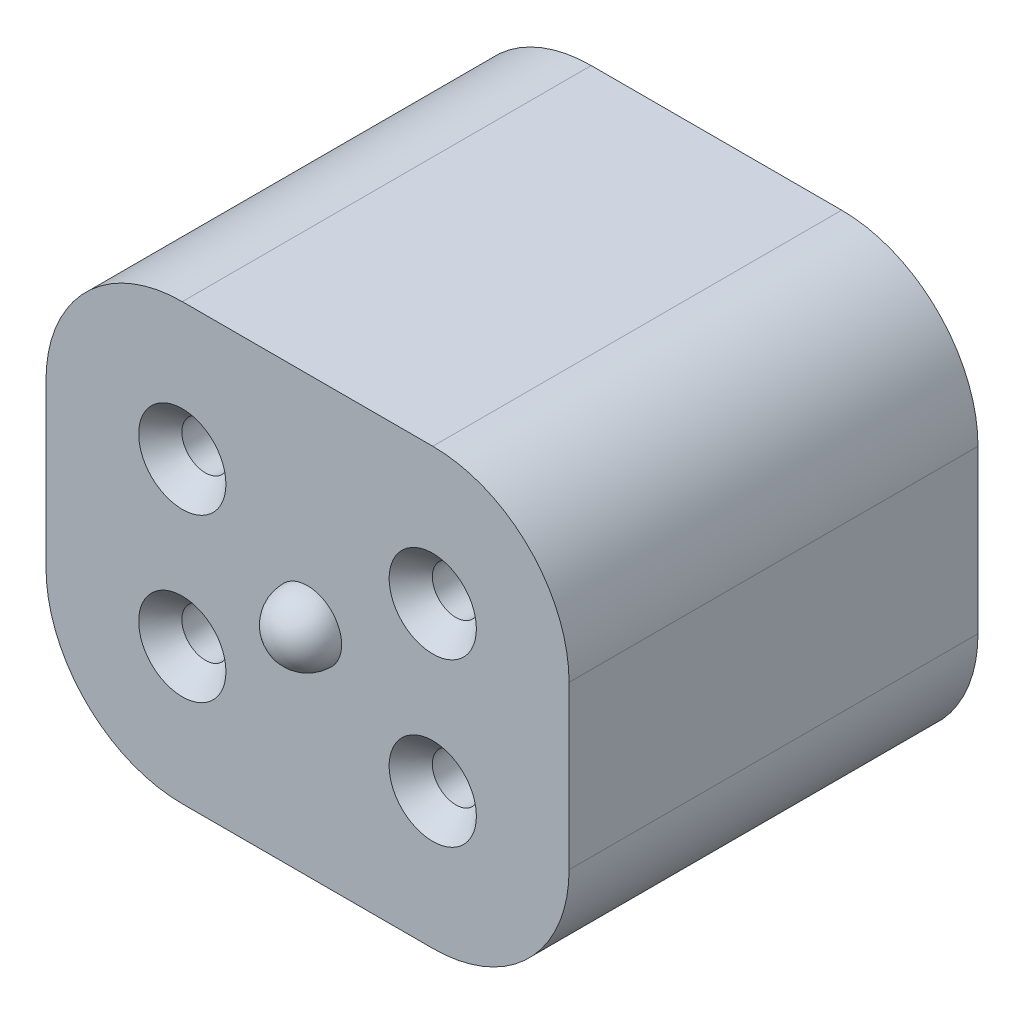
ISO-10303-21;
HEADER;
FILE_DESCRIPTION(('STEP AP214'),'2;1');
FILE_NAME('part.step','',(''),(''),'','','');
FILE_SCHEMA(('AUTOMOTIVE_DESIGN { 1 0 10303 214 1 1 1 1 }'));
ENDSEC;
DATA;
#1=APPLICATION_CONTEXT('core data for automotive mechanical design processes');
#2=APPLICATION_PROTOCOL_DEFINITION('international standard','automotive_design',2000,#1);
#3=PRODUCT_CONTEXT('',#1,'mechanical');
#4=PRODUCT('Part','Part','',(#3));
#5=PRODUCT_RELATED_PRODUCT_CATEGORY('part','',(#4));
#6=PRODUCT_DEFINITION_FORMATION('','',#4);
#7=PRODUCT_DEFINITION_CONTEXT('part definition',#1,'design');
#8=PRODUCT_DEFINITION('design','',#6,#7);
#9=PRODUCT_DEFINITION_SHAPE('','',#8);
#10=(LENGTH_UNIT() NAMED_UNIT(*) SI_UNIT(.MILLI.,.METRE.));
#11=(NAMED_UNIT(*) PLANE_ANGLE_UNIT() SI_UNIT($,.RADIAN.));
#12=(NAMED_UNIT(*) SI_UNIT($,.STERADIAN.) SOLID_ANGLE_UNIT());
#13=UNCERTAINTY_MEASURE_WITH_UNIT(LENGTH_MEASURE(1.E-05),#10,'distance_accuracy_value','');
#14=(GEOMETRIC_REPRESENTATION_CONTEXT(3) GLOBAL_UNCERTAINTY_ASSIGNED_CONTEXT((#13)) GLOBAL_UNIT_ASSIGNED_CONTEXT((#10,
#11,#12)) REPRESENTATION_CONTEXT('',''));
#15=CARTESIAN_POINT('',(0.,0.,0.));
#16=DIRECTION('',(0.,0.,1.));
#17=DIRECTION('',(1.,0.,0.));
#18=AXIS2_PLACEMENT_3D('',#15,#16,#17);
#19=CARTESIAN_POINT('',(9.99999999999999,-9.99999999999999,30.));
#20=DIRECTION('',(0.,0.,1.));
#21=DIRECTION('',(1.,0.,0.));
#22=AXIS2_PLACEMENT_3D('',#19,#20,#21);
#23=CYLINDRICAL_SURFACE('',#22,1.72719999999999);
#24=CARTESIAN_POINT('',(9.99999999999999,-9.99999999999999,28.305277262482));
#25=DIRECTION('',(0.,0.,1.));
#26=DIRECTION('',(1.,0.,0.));
#27=AXIS2_PLACEMENT_3D('',#24,#25,#26);
#28=CIRCLE('',#27,1.72719999999999);
#29=CARTESIAN_POINT('',(11.7272,-9.99999999999999,28.305277262482));
#30=VERTEX_POINT('',#29);
#31=EDGE_CURVE('E262',#30,#30,#28,.T.);
#32=ORIENTED_EDGE('',*,*,#31,.T.);
#33=EDGE_LOOP('',(#32));
#34=FACE_BOUND('',#33,.T.);
#35=DIRECTION('',(0.,0.,-1.));
#36=VECTOR('',#35,1.);
#37=CARTESIAN_POINT('',(11.4494959190641,-10.9392451334005,10.));
#38=LINE('',#37,#36);
#39=CARTESIAN_POINT('',(11.4494959190641,-10.9392451334005,10.));
#40=VERTEX_POINT('',#39);
#41=CARTESIAN_POINT('',(11.4494959190641,-10.9392451334005,0.));
#42=VERTEX_POINT('',#41);
#43=EDGE_CURVE('E224',#40,#42,#38,.T.);
#44=ORIENTED_EDGE('',*,*,#43,.F.);
#45=CARTESIAN_POINT('',(9.99999999999999,-9.99999999999999,10.));
#46=DIRECTION('',(0.,0.,-1.));
#47=DIRECTION('',(-1.,0.,0.));
#48=AXIS2_PLACEMENT_3D('',#45,#46,#47);
#49=CIRCLE('',#48,1.72719999999999);
#50=CARTESIAN_POINT('',(9.99999999999999,-11.7272,10.));
#51=VERTEX_POINT('',#50);
#52=EDGE_CURVE('E200',#51,#40,#49,.F.);
#53=ORIENTED_EDGE('',*,*,#52,.F.);
#54=DIRECTION('',(0.,0.,-1.));
#55=VECTOR('',#54,1.);
#56=CARTESIAN_POINT('',(9.99999999999999,-11.7272,10.));
#57=LINE('',#56,#55);
#58=CARTESIAN_POINT('',(9.99999999999999,-11.7272,0.));
#59=VERTEX_POINT('',#58);
#60=EDGE_CURVE('E228',#51,#59,#57,.T.);
#61=ORIENTED_EDGE('',*,*,#60,.T.);
#62=CARTESIAN_POINT('',(9.99999999999999,-9.99999999999999,0.));
#63=DIRECTION('',(0.,0.,1.));
#64=DIRECTION('',(1.,0.,0.));
#65=AXIS2_PLACEMENT_3D('',#62,#63,#64);
#66=CIRCLE('',#65,1.72719999999999);
#67=EDGE_CURVE('E266',#42,#59,#66,.T.);
#68=ORIENTED_EDGE('',*,*,#67,.F.);
#69=EDGE_LOOP('',(#44,#53,#61,#68));
#70=FACE_BOUND('',#69,.T.);
#71=ADVANCED_FACE('F43',(#34,#70),#23,.F.);
#72=CARTESIAN_POINT('',(28.375875601355,-10.,30.));
#73=DIRECTION('',(0.,0.,-1.));
#74=DIRECTION('',(-1.,0.,0.));
#75=AXIS2_PLACEMENT_3D('',#72,#73,#74);
#76=CYLINDRICAL_SURFACE('',#75,9.99999999999999);
#77=CARTESIAN_POINT('',(28.375875601355,-10.,0.));
#78=DIRECTION('',(0.,0.,1.));
#79=DIRECTION('',(1.,0.,0.));
#80=AXIS2_PLACEMENT_3D('',#77,#78,#79);
#81=CIRCLE('',#80,9.99999999999999);
#82=CARTESIAN_POINT('',(28.375875601355,0.,0.));
#83=VERTEX_POINT('',#82);
#84=CARTESIAN_POINT('',(38.375875601355,-10.,0.));
#85=VERTEX_POINT('',#84);
#86=EDGE_CURVE('E306',#83,#85,#81,.F.);
#87=ORIENTED_EDGE('',*,*,#86,.F.);
#88=DIRECTION('',(0.,0.,-1.));
#89=VECTOR('',#88,1.);
#90=CARTESIAN_POINT('',(28.375875601355,0.,30.));
#91=LINE('',#90,#89);
#92=CARTESIAN_POINT('',(28.375875601355,0.,30.));
#93=VERTEX_POINT('',#92);
#94=EDGE_CURVE('E387',#93,#83,#91,.T.);
#95=ORIENTED_EDGE('',*,*,#94,.F.);
#96=CARTESIAN_POINT('',(28.375875601355,-10.,30.));
#97=DIRECTION('',(0.,0.,1.));
#98=DIRECTION('',(1.,0.,0.));
#99=AXIS2_PLACEMENT_3D('',#96,#97,#98);
#100=CIRCLE('',#99,9.99999999999999);
#101=CARTESIAN_POINT('',(38.375875601355,-10.,30.));
#102=VERTEX_POINT('',#101);
#103=EDGE_CURVE('E307',#93,#102,#100,.F.);
#104=ORIENTED_EDGE('',*,*,#103,.T.);
#105=DIRECTION('',(0.,0.,-1.));
#106=VECTOR('',#105,1.);
#107=CARTESIAN_POINT('',(38.375875601355,-10.,30.));
#108=LINE('',#107,#106);
#109=EDGE_CURVE('E336',#102,#85,#108,.T.);
#110=ORIENTED_EDGE('',*,*,#109,.T.);
#111=EDGE_LOOP('',(#87,#95,#104,#110));
#112=FACE_BOUND('',#111,.T.);
#113=ADVANCED_FACE('F45',(#112),#76,.T.);
#114=CARTESIAN_POINT('',(0.,0.,30.));
#115=DIRECTION('',(0.,-1.,0.));
#116=DIRECTION('',(0.,0.,-1.));
#117=AXIS2_PLACEMENT_3D('',#114,#115,#116);
#118=PLANE('',#117);
#119=DIRECTION('',(-1.,0.,0.));
#120=VECTOR('',#119,1.);
#121=CARTESIAN_POINT('',(0.,0.,0.));
#122=LINE('',#121,#120);
#123=CARTESIAN_POINT('',(10.0000000000001,0.,0.));
#124=VERTEX_POINT('',#123);
#125=EDGE_CURVE('E340',#83,#124,#122,.T.);
#126=ORIENTED_EDGE('',*,*,#125,.T.);
#127=DIRECTION('',(0.,0.,-1.));
#128=VECTOR('',#127,1.);
#129=CARTESIAN_POINT('',(10.0000000000001,0.,30.));
#130=LINE('',#129,#128);
#131=CARTESIAN_POINT('',(10.0000000000001,0.,30.));
#132=VERTEX_POINT('',#131);
#133=EDGE_CURVE('E384',#132,#124,#130,.T.);
#134=ORIENTED_EDGE('',*,*,#133,.F.);
#135=DIRECTION('',(-1.,0.,0.));
#136=VECTOR('',#135,1.);
#137=CARTESIAN_POINT('',(0.,0.,30.));
#138=LINE('',#137,#136);
#139=EDGE_CURVE('E311',#93,#132,#138,.T.);
#140=ORIENTED_EDGE('',*,*,#139,.F.);
#141=ORIENTED_EDGE('',*,*,#94,.T.);
#142=EDGE_LOOP('',(#126,#134,#140,#141));
#143=FACE_BOUND('',#142,.T.);
#144=ADVANCED_FACE('F475',(#143),#118,.F.);
#145=CARTESIAN_POINT('',(9.99999999999999,-9.99999999999999,30.));
#146=DIRECTION('',(0.,0.,-1.));
#147=DIRECTION('',(-1.,0.,0.));
#148=AXIS2_PLACEMENT_3D('',#145,#146,#147);
#149=CYLINDRICAL_SURFACE('',#148,9.99999999999999);
#150=CARTESIAN_POINT('',(9.99999999999999,-9.99999999999999,0.));
#151=DIRECTION('',(0.,0.,1.));
#152=DIRECTION('',(1.,0.,0.));
#153=AXIS2_PLACEMENT_3D('',#150,#151,#152);
#154=CIRCLE('',#153,9.99999999999999);
#155=CARTESIAN_POINT('',(0.,-10.0000000000001,0.));
#156=VERTEX_POINT('',#155);
#157=EDGE_CURVE('E344',#156,#124,#154,.F.);
#158=ORIENTED_EDGE('',*,*,#157,.F.);
#159=DIRECTION('',(0.,0.,-1.));
#160=VECTOR('',#159,1.);
#161=CARTESIAN_POINT('',(0.,-10.0000000000001,30.));
#162=LINE('',#161,#160);
#163=CARTESIAN_POINT('',(0.,-10.0000000000001,30.));
#164=VERTEX_POINT('',#163);
#165=EDGE_CURVE('E381',#164,#156,#162,.T.);
#166=ORIENTED_EDGE('',*,*,#165,.F.);
#167=CARTESIAN_POINT('',(9.99999999999999,-9.99999999999999,30.));
#168=DIRECTION('',(0.,0.,1.));
#169=DIRECTION('',(1.,0.,0.));
#170=AXIS2_PLACEMENT_3D('',#167,#168,#169);
#171=CIRCLE('',#170,9.99999999999999);
#172=EDGE_CURVE('E315',#164,#132,#171,.F.);
#173=ORIENTED_EDGE('',*,*,#172,.T.);
#174=ORIENTED_EDGE('',*,*,#133,.T.);
#175=EDGE_LOOP('',(#158,#166,#173,#174));
#176=FACE_BOUND('',#175,.T.);
#177=ADVANCED_FACE('F524',(#176),#149,.T.);
#178=CARTESIAN_POINT('',(0.,0.,30.));
#179=DIRECTION('',(1.,0.,0.));
#180=DIRECTION('',(0.,1.,0.));
#181=AXIS2_PLACEMENT_3D('',#178,#179,#180);
#182=PLANE('',#181);
#183=DIRECTION('',(0.,-1.,0.));
#184=VECTOR('',#183,1.);
#185=CARTESIAN_POINT('',(0.,0.,0.));
#186=LINE('',#185,#184);
#187=CARTESIAN_POINT('',(0.,-21.9072096054535,0.));
#188=VERTEX_POINT('',#187);
#189=EDGE_CURVE('E348',#156,#188,#186,.T.);
#190=ORIENTED_EDGE('',*,*,#189,.T.);
#191=DIRECTION('',(0.,0.,-1.));
#192=VECTOR('',#191,1.);
#193=CARTESIAN_POINT('',(0.,-21.9072096054535,30.));
#194=LINE('',#193,#192);
#195=CARTESIAN_POINT('',(0.,-21.9072096054535,30.));
#196=VERTEX_POINT('',#195);
#197=EDGE_CURVE('E378',#196,#188,#194,.T.);
#198=ORIENTED_EDGE('',*,*,#197,.F.);
#199=DIRECTION('',(0.,-1.,0.));
#200=VECTOR('',#199,1.);
#201=CARTESIAN_POINT('',(0.,0.,30.));
#202=LINE('',#201,#200);
#203=EDGE_CURVE('E319',#164,#196,#202,.T.);
#204=ORIENTED_EDGE('',*,*,#203,.F.);
#205=ORIENTED_EDGE('',*,*,#165,.T.);
#206=EDGE_LOOP('',(#190,#198,#204,#205));
#207=FACE_BOUND('',#206,.T.);
#208=ADVANCED_FACE('F520',(#207),#182,.F.);
#209=CARTESIAN_POINT('',(10.,-21.9072096054535,30.));
#210=DIRECTION('',(0.,0.,-1.));
#211=DIRECTION('',(-1.,0.,0.));
#212=AXIS2_PLACEMENT_3D('',#209,#210,#211);
#213=CYLINDRICAL_SURFACE('',#212,9.99999999999999);
#214=CARTESIAN_POINT('',(10.,-21.9072096054535,0.));
#215=DIRECTION('',(0.,0.,1.));
#216=DIRECTION('',(1.,0.,0.));
#217=AXIS2_PLACEMENT_3D('',#214,#215,#216);
#218=CIRCLE('',#217,9.99999999999999);
#219=CARTESIAN_POINT('',(10.,-31.9072096054535,0.));
#220=VERTEX_POINT('',#219);
#221=EDGE_CURVE('E352',#220,#188,#218,.F.);
#222=ORIENTED_EDGE('',*,*,#221,.F.);
#223=DIRECTION('',(0.,0.,-1.));
#224=VECTOR('',#223,1.);
#225=CARTESIAN_POINT('',(10.,-31.9072096054535,30.));
#226=LINE('',#225,#224);
#227=CARTESIAN_POINT('',(10.,-31.9072096054535,30.));
#228=VERTEX_POINT('',#227);
#229=EDGE_CURVE('E375',#228,#220,#226,.T.);
#230=ORIENTED_EDGE('',*,*,#229,.F.);
#231=CARTESIAN_POINT('',(10.,-21.9072096054535,30.));
#232=DIRECTION('',(0.,0.,1.));
#233=DIRECTION('',(1.,0.,0.));
#234=AXIS2_PLACEMENT_3D('',#231,#232,#233);
#235=CIRCLE('',#234,9.99999999999999);
#236=EDGE_CURVE('E322',#228,#196,#235,.F.);
#237=ORIENTED_EDGE('',*,*,#236,.T.);
#238=ORIENTED_EDGE('',*,*,#197,.T.);
#239=EDGE_LOOP('',(#222,#230,#237,#238));
#240=FACE_BOUND('',#239,.T.);
#241=ADVANCED_FACE('F516',(#240),#213,.T.);
#242=CARTESIAN_POINT('',(0.,-31.9072096054535,30.));
#243=DIRECTION('',(0.,1.,0.));
#244=DIRECTION('',(0.,0.,1.));
#245=AXIS2_PLACEMENT_3D('',#242,#243,#244);
#246=PLANE('',#245);
#247=DIRECTION('',(1.,0.,0.));
#248=VECTOR('',#247,1.);
#249=CARTESIAN_POINT('',(0.,-31.9072096054535,0.));
#250=LINE('',#249,#248);
#251=CARTESIAN_POINT('',(28.375875601355,-31.9072096054535,0.));
#252=VERTEX_POINT('',#251);
#253=EDGE_CURVE('E356',#220,#252,#250,.T.);
#254=ORIENTED_EDGE('',*,*,#253,.T.);
#255=DIRECTION('',(0.,0.,-1.));
#256=VECTOR('',#255,1.);
#257=CARTESIAN_POINT('',(28.375875601355,-31.9072096054535,30.));
#258=LINE('',#257,#256);
#259=CARTESIAN_POINT('',(28.375875601355,-31.9072096054535,30.));
#260=VERTEX_POINT('',#259);
#261=EDGE_CURVE('E372',#260,#252,#258,.T.);
#262=ORIENTED_EDGE('',*,*,#261,.F.);
#263=DIRECTION('',(1.,0.,0.));
#264=VECTOR('',#263,1.);
#265=CARTESIAN_POINT('',(0.,-31.9072096054535,30.));
#266=LINE('',#265,#264);
#267=EDGE_CURVE('E326',#228,#260,#266,.T.);
#268=ORIENTED_EDGE('',*,*,#267,.F.);
#269=ORIENTED_EDGE('',*,*,#229,.T.);
#270=EDGE_LOOP('',(#254,#262,#268,#269));
#271=FACE_BOUND('',#270,.T.);
#272=ADVANCED_FACE('F512',(#271),#246,.F.);
#273=CARTESIAN_POINT('',(28.375875601355,-21.9072096054535,30.));
#274=DIRECTION('',(0.,0.,-1.));
#275=DIRECTION('',(-1.,0.,0.));
#276=AXIS2_PLACEMENT_3D('',#273,#274,#275);
#277=CYLINDRICAL_SURFACE('',#276,9.99999999999999);
#278=CARTESIAN_POINT('',(28.375875601355,-21.9072096054535,0.));
#279=DIRECTION('',(0.,0.,1.));
#280=DIRECTION('',(1.,0.,0.));
#281=AXIS2_PLACEMENT_3D('',#278,#279,#280);
#282=CIRCLE('',#281,9.99999999999999);
#283=CARTESIAN_POINT('',(38.375875601355,-21.9072096054535,0.));
#284=VERTEX_POINT('',#283);
#285=EDGE_CURVE('E360',#284,#252,#282,.F.);
#286=ORIENTED_EDGE('',*,*,#285,.F.);
#287=DIRECTION('',(0.,0.,-1.));
#288=VECTOR('',#287,1.);
#289=CARTESIAN_POINT('',(38.375875601355,-21.9072096054535,30.));
#290=LINE('',#289,#288);
#291=CARTESIAN_POINT('',(38.375875601355,-21.9072096054535,30.));
#292=VERTEX_POINT('',#291);
#293=EDGE_CURVE('E369',#292,#284,#290,.T.);
#294=ORIENTED_EDGE('',*,*,#293,.F.);
#295=CARTESIAN_POINT('',(28.375875601355,-21.9072096054535,30.));
#296=DIRECTION('',(0.,0.,1.));
#297=DIRECTION('',(1.,0.,0.));
#298=AXIS2_PLACEMENT_3D('',#295,#296,#297);
#299=CIRCLE('',#298,9.99999999999999);
#300=EDGE_CURVE('E329',#292,#260,#299,.F.);
#301=ORIENTED_EDGE('',*,*,#300,.T.);
#302=ORIENTED_EDGE('',*,*,#261,.T.);
#303=EDGE_LOOP('',(#286,#294,#301,#302));
#304=FACE_BOUND('',#303,.T.);
#305=ADVANCED_FACE('F508',(#304),#277,.T.);
#306=CARTESIAN_POINT('',(38.375875601355,0.,30.));
#307=DIRECTION('',(-1.,0.,0.));
#308=DIRECTION('',(0.,0.,1.));
#309=AXIS2_PLACEMENT_3D('',#306,#307,#308);
#310=PLANE('',#309);
#311=DIRECTION('',(0.,1.,0.));
#312=VECTOR('',#311,1.);
#313=CARTESIAN_POINT('',(38.375875601355,0.,0.));
#314=LINE('',#313,#312);
#315=EDGE_CURVE('E312',#284,#85,#314,.T.);
#316=ORIENTED_EDGE('',*,*,#315,.T.);
#317=ORIENTED_EDGE('',*,*,#109,.F.);
#318=DIRECTION('',(0.,1.,0.));
#319=VECTOR('',#318,1.);
#320=CARTESIAN_POINT('',(38.375875601355,0.,30.));
#321=LINE('',#320,#319);
#322=EDGE_CURVE('E333',#292,#102,#321,.T.);
#323=ORIENTED_EDGE('',*,*,#322,.F.);
#324=ORIENTED_EDGE('',*,*,#293,.T.);
#325=EDGE_LOOP('',(#316,#317,#323,#324));
#326=FACE_BOUND('',#325,.T.);
#327=ADVANCED_FACE('F502',(#326),#310,.F.);
#328=CARTESIAN_POINT('',(0.,0.,30.));
#329=DIRECTION('',(0.,0.,1.));
#330=DIRECTION('',(1.,0.,0.));
#331=AXIS2_PLACEMENT_3D('',#328,#329,#330);
#332=PLANE('',#331);
#333=CARTESIAN_POINT('',(19.1879378006775,-15.9536048027268,30.));
#334=DIRECTION('',(0.,0.,1.));
#335=DIRECTION('',(1.,0.,0.));
#336=AXIS2_PLACEMENT_3D('',#333,#334,#335);
#337=CIRCLE('',#336,2.5);
#338=CARTESIAN_POINT('',(21.6879378006775,-15.9536048027268,30.));
#339=VERTEX_POINT('',#338);
#340=EDGE_CURVE('E11',#339,#339,#337,.T.);
#341=ORIENTED_EDGE('',*,*,#340,.F.);
#342=EDGE_LOOP('',(#341));
#343=FACE_BOUND('',#342,.T.);
#344=CARTESIAN_POINT('',(9.99999999999999,-9.99999999999999,30.));
#345=DIRECTION('',(0.,0.,1.));
#346=DIRECTION('',(1.,0.,0.));
#347=AXIS2_PLACEMENT_3D('',#344,#345,#346);
#348=CIRCLE('',#347,3.2004);
#349=CARTESIAN_POINT('',(13.2004,-9.99999999999999,30.));
#350=VERTEX_POINT('',#349);
#351=EDGE_CURVE('E258',#350,#350,#348,.T.);
#352=ORIENTED_EDGE('',*,*,#351,.F.);
#353=EDGE_LOOP('',(#352));
#354=FACE_BOUND('',#353,.T.);
#355=CARTESIAN_POINT('',(28.375875601355,-10.,30.));
#356=DIRECTION('',(0.,0.,1.));
#357=DIRECTION('',(1.,0.,0.));
#358=AXIS2_PLACEMENT_3D('',#355,#356,#357);
#359=CIRCLE('',#358,3.2004);
#360=CARTESIAN_POINT('',(31.576275601355,-10.,30.));
#361=VERTEX_POINT('',#360);
#362=EDGE_CURVE('E270',#361,#361,#359,.T.);
#363=ORIENTED_EDGE('',*,*,#362,.F.);
#364=EDGE_LOOP('',(#363));
#365=FACE_BOUND('',#364,.T.);
#366=CARTESIAN_POINT('',(28.375875601355,-21.9072096054535,30.));
#367=DIRECTION('',(0.,0.,1.));
#368=DIRECTION('',(1.,0.,0.));
#369=AXIS2_PLACEMENT_3D('',#366,#367,#368);
#370=CIRCLE('',#369,3.2004);
#371=CARTESIAN_POINT('',(31.576275601355,-21.9072096054535,30.));
#372=VERTEX_POINT('',#371);
#373=EDGE_CURVE('E282',#372,#372,#370,.T.);
#374=ORIENTED_EDGE('',*,*,#373,.F.);
#375=EDGE_LOOP('',(#374));
#376=FACE_BOUND('',#375,.T.);
#377=CARTESIAN_POINT('',(10.,-21.9072096054535,30.));
#378=DIRECTION('',(0.,0.,1.));
#379=DIRECTION('',(1.,0.,0.));
#380=AXIS2_PLACEMENT_3D('',#377,#378,#379);
#381=CIRCLE('',#380,3.2004);
#382=CARTESIAN_POINT('',(13.2004,-21.9072096054535,30.));
#383=VERTEX_POINT('',#382);
#384=EDGE_CURVE('E294',#383,#383,#381,.T.);
#385=ORIENTED_EDGE('',*,*,#384,.F.);
#386=EDGE_LOOP('',(#385));
#387=FACE_BOUND('',#386,.T.);
#388=ORIENTED_EDGE('',*,*,#103,.F.);
#389=ORIENTED_EDGE('',*,*,#139,.T.);
#390=ORIENTED_EDGE('',*,*,#172,.F.);
#391=ORIENTED_EDGE('',*,*,#203,.T.);
#392=ORIENTED_EDGE('',*,*,#236,.F.);
#393=ORIENTED_EDGE('',*,*,#267,.T.);
#394=ORIENTED_EDGE('',*,*,#300,.F.);
#395=ORIENTED_EDGE('',*,*,#322,.T.);
#396=EDGE_LOOP('',(#388,#389,#390,#391,#392,#393,#394,#395));
#397=FACE_BOUND('',#396,.T.);
#398=ADVANCED_FACE('F499',(#343,#354,#365,#376,#387,#397),#332,.T.);
#399=CARTESIAN_POINT('',(0.,0.,0.));
#400=DIRECTION('',(0.,0.,1.));
#401=DIRECTION('',(1.,0.,0.));
#402=AXIS2_PLACEMENT_3D('',#399,#400,#401);
#403=PLANE('',#402);
#404=DIRECTION('',(0.839217183339566,0.543796394974815,0.));
#405=VECTOR('',#404,1.);
#406=CARTESIAN_POINT('',(19.1879378006775,-15.9536048027268,0.));
#407=LINE('',#406,#405);
#408=CARTESIAN_POINT('',(21.4986260844294,-14.4563237847016,0.));
#409=VERTEX_POINT('',#408);
#410=CARTESIAN_POINT('',(26.9263796822909,-10.9392451334005,0.));
#411=VERTEX_POINT('',#410);
#412=EDGE_CURVE('E237',#409,#411,#407,.T.);
#413=ORIENTED_EDGE('',*,*,#412,.F.);
#414=CARTESIAN_POINT('',(19.1837417147608,-15.9563237847016,0.));
#415=DIRECTION('',(0.,0.,-1.));
#416=DIRECTION('',(-1.,0.,0.));
#417=AXIS2_PLACEMENT_3D('',#414,#415,#416);
#418=CIRCLE('',#417,2.75838533293231);
#419=CARTESIAN_POINT('',(16.8713422003401,-14.4524959585716,0.));
#420=VERTEX_POINT('',#419);
#421=EDGE_CURVE('E423',#420,#409,#418,.T.);
#422=ORIENTED_EDGE('',*,*,#421,.F.);
#423=DIRECTION('',(-0.839217183339566,0.543796394974815,0.));
#424=VECTOR('',#423,1.);
#425=CARTESIAN_POINT('',(-1.60648759713369,-2.4792220191142,0.));
#426=LINE('',#425,#424);
#427=EDGE_CURVE('E193',#420,#42,#426,.T.);
#428=ORIENTED_EDGE('',*,*,#427,.T.);
#429=ORIENTED_EDGE('',*,*,#67,.T.);
#430=DIRECTION('',(0.,1.,0.));
#431=VECTOR('',#430,1.);
#432=CARTESIAN_POINT('',(9.99999999999999,0.,0.));
#433=LINE('',#432,#431);
#434=CARTESIAN_POINT('',(10.,-20.1800096054535,0.));
#435=VERTEX_POINT('',#434);
#436=EDGE_CURVE('E217',#435,#59,#433,.T.);
#437=ORIENTED_EDGE('',*,*,#436,.F.);
#438=CARTESIAN_POINT('',(10.,-21.9072096054535,0.));
#439=DIRECTION('',(0.,0.,1.));
#440=DIRECTION('',(1.,0.,0.));
#441=AXIS2_PLACEMENT_3D('',#438,#439,#440);
#442=CIRCLE('',#441,1.72719999999999);
#443=CARTESIAN_POINT('',(11.4494959190641,-20.967964472053,0.));
#444=VERTEX_POINT('',#443);
#445=EDGE_CURVE('E302',#435,#444,#442,.T.);
#446=ORIENTED_EDGE('',*,*,#445,.T.);
#447=DIRECTION('',(-0.839217183339566,-0.543796394974816,0.));
#448=VECTOR('',#447,1.);
#449=CARTESIAN_POINT('',(12.9547911989918,-19.9925624392445,0.));
#450=LINE('',#449,#448);
#451=CARTESIAN_POINT('',(16.8688573450922,-17.4563237847016,0.));
#452=VERTEX_POINT('',#451);
#453=EDGE_CURVE('E214',#452,#444,#450,.T.);
#454=ORIENTED_EDGE('',*,*,#453,.F.);
#455=CARTESIAN_POINT('',(21.5011046032988,-17.4524918527217,0.));
#456=VERTEX_POINT('',#455);
#457=EDGE_CURVE('E419',#456,#452,#418,.T.);
#458=ORIENTED_EDGE('',*,*,#457,.F.);
#459=DIRECTION('',(-0.839217183339566,0.543796394974815,0.));
#460=VECTOR('',#459,1.);
#461=CARTESIAN_POINT('',(28.375875601355,-21.9072096054535,0.));
#462=LINE('',#461,#460);
#463=CARTESIAN_POINT('',(26.9263796822909,-20.967964472053,0.));
#464=VERTEX_POINT('',#463);
#465=EDGE_CURVE('E218',#464,#456,#462,.T.);
#466=ORIENTED_EDGE('',*,*,#465,.F.);
#467=CARTESIAN_POINT('',(28.375875601355,-21.9072096054535,0.));
#468=DIRECTION('',(0.,0.,1.));
#469=DIRECTION('',(1.,0.,0.));
#470=AXIS2_PLACEMENT_3D('',#467,#468,#469);
#471=CIRCLE('',#470,1.72719999999999);
#472=CARTESIAN_POINT('',(28.375875601355,-20.1800096054535,0.));
#473=VERTEX_POINT('',#472);
#474=EDGE_CURVE('E290',#464,#473,#471,.T.);
#475=ORIENTED_EDGE('',*,*,#474,.T.);
#476=DIRECTION('',(0.,-1.,0.));
#477=VECTOR('',#476,1.);
#478=CARTESIAN_POINT('',(28.375875601355,-10.,0.));
#479=LINE('',#478,#477);
#480=CARTESIAN_POINT('',(28.375875601355,-11.7272,0.));
#481=VERTEX_POINT('',#480);
#482=EDGE_CURVE('E234',#481,#473,#479,.T.);
#483=ORIENTED_EDGE('',*,*,#482,.F.);
#484=CARTESIAN_POINT('',(28.375875601355,-10.,0.));
#485=DIRECTION('',(0.,0.,1.));
#486=DIRECTION('',(1.,0.,0.));
#487=AXIS2_PLACEMENT_3D('',#484,#485,#486);
#488=CIRCLE('',#487,1.72719999999999);
#489=EDGE_CURVE('E278',#481,#411,#488,.T.);
#490=ORIENTED_EDGE('',*,*,#489,.T.);
#491=EDGE_LOOP('',(#413,#422,#428,#429,#437,#446,#454,#458,#466,#475,#483,#490));
#492=FACE_BOUND('',#491,.T.);
#493=ORIENTED_EDGE('',*,*,#86,.T.);
#494=ORIENTED_EDGE('',*,*,#315,.F.);
#495=ORIENTED_EDGE('',*,*,#285,.T.);
#496=ORIENTED_EDGE('',*,*,#253,.F.);
#497=ORIENTED_EDGE('',*,*,#221,.T.);
#498=ORIENTED_EDGE('',*,*,#189,.F.);
#499=ORIENTED_EDGE('',*,*,#157,.T.);
#500=ORIENTED_EDGE('',*,*,#125,.F.);
#501=EDGE_LOOP('',(#493,#494,#495,#496,#497,#498,#499,#500));
#502=FACE_BOUND('',#501,.T.);
#503=ADVANCED_FACE('F415',(#492,#502),#403,.F.);
#504=CARTESIAN_POINT('',(10.,-21.9072096054535,30.));
#505=DIRECTION('',(0.,0.,1.));
#506=DIRECTION('',(1.,0.,0.));
#507=AXIS2_PLACEMENT_3D('',#504,#505,#506);
#508=CYLINDRICAL_SURFACE('',#507,1.72719999999999);
#509=ORIENTED_EDGE('',*,*,#445,.F.);
#510=DIRECTION('',(0.,0.,-1.));
#511=VECTOR('',#510,1.);
#512=CARTESIAN_POINT('',(10.,-20.1800096054535,10.));
#513=LINE('',#512,#511);
#514=CARTESIAN_POINT('',(10.,-20.1800096054535,10.));
#515=VERTEX_POINT('',#514);
#516=EDGE_CURVE('E208',#515,#435,#513,.T.);
#517=ORIENTED_EDGE('',*,*,#516,.F.);
#518=CARTESIAN_POINT('',(10.,-21.9072096054535,10.));
#519=DIRECTION('',(0.,0.,-1.));
#520=DIRECTION('',(-1.,0.,0.));
#521=AXIS2_PLACEMENT_3D('',#518,#519,#520);
#522=CIRCLE('',#521,1.72719999999999);
#523=CARTESIAN_POINT('',(11.4494959190641,-20.967964472053,10.));
#524=VERTEX_POINT('',#523);
#525=EDGE_CURVE('E436',#524,#515,#522,.F.);
#526=ORIENTED_EDGE('',*,*,#525,.F.);
#527=DIRECTION('',(0.,0.,-1.));
#528=VECTOR('',#527,1.);
#529=CARTESIAN_POINT('',(11.4494959190641,-20.967964472053,10.));
#530=LINE('',#529,#528);
#531=EDGE_CURVE('E203',#524,#444,#530,.T.);
#532=ORIENTED_EDGE('',*,*,#531,.T.);
#533=EDGE_LOOP('',(#509,#517,#526,#532));
#534=FACE_BOUND('',#533,.T.);
#535=CARTESIAN_POINT('',(10.,-21.9072096054535,28.305277262482));
#536=DIRECTION('',(0.,0.,1.));
#537=DIRECTION('',(1.,0.,0.));
#538=AXIS2_PLACEMENT_3D('',#535,#536,#537);
#539=CIRCLE('',#538,1.72719999999999);
#540=CARTESIAN_POINT('',(11.7272,-21.9072096054535,28.305277262482));
#541=VERTEX_POINT('',#540);
#542=EDGE_CURVE('E298',#541,#541,#539,.T.);
#543=ORIENTED_EDGE('',*,*,#542,.T.);
#544=EDGE_LOOP('',(#543));
#545=FACE_BOUND('',#544,.T.);
#546=ADVANCED_FACE('F494',(#534,#545),#508,.F.);
#547=CARTESIAN_POINT('',(10.,-21.9072096054535,30.));
#548=DIRECTION('',(0.,0.,1.));
#549=DIRECTION('',(1.,0.,0.));
#550=AXIS2_PLACEMENT_3D('',#547,#548,#549);
#551=CONICAL_SURFACE('',#550,3.2004,0.715584993317675);
#552=ORIENTED_EDGE('',*,*,#542,.F.);
#553=EDGE_LOOP('',(#552));
#554=FACE_BOUND('',#553,.T.);
#555=ORIENTED_EDGE('',*,*,#384,.T.);
#556=EDGE_LOOP('',(#555));
#557=FACE_BOUND('',#556,.T.);
#558=ADVANCED_FACE('F491',(#554,#557),#551,.F.);
#559=CARTESIAN_POINT('',(28.375875601355,-21.9072096054535,30.));
#560=DIRECTION('',(0.,0.,1.));
#561=DIRECTION('',(1.,0.,0.));
#562=AXIS2_PLACEMENT_3D('',#559,#560,#561);
#563=CYLINDRICAL_SURFACE('',#562,1.72719999999999);
#564=ORIENTED_EDGE('',*,*,#474,.F.);
#565=DIRECTION('',(0.,0.,1.));
#566=VECTOR('',#565,1.);
#567=CARTESIAN_POINT('',(26.9263796822909,-20.967964472053,30.));
#568=LINE('',#567,#566);
#569=CARTESIAN_POINT('',(26.9263796822909,-20.967964472053,10.));
#570=VERTEX_POINT('',#569);
#571=EDGE_CURVE('E52',#464,#570,#568,.T.);
#572=ORIENTED_EDGE('',*,*,#571,.T.);
#573=CARTESIAN_POINT('',(28.375875601355,-21.9072096054535,10.));
#574=DIRECTION('',(0.,0.,-1.));
#575=DIRECTION('',(-1.,0.,0.));
#576=AXIS2_PLACEMENT_3D('',#573,#574,#575);
#577=CIRCLE('',#576,1.72719999999999);
#578=CARTESIAN_POINT('',(28.375875601355,-20.1800096054535,10.));
#579=VERTEX_POINT('',#578);
#580=EDGE_CURVE('E227',#579,#570,#577,.F.);
#581=ORIENTED_EDGE('',*,*,#580,.F.);
#582=DIRECTION('',(0.,0.,1.));
#583=VECTOR('',#582,1.);
#584=CARTESIAN_POINT('',(28.375875601355,-20.1800096054535,30.));
#585=LINE('',#584,#583);
#586=EDGE_CURVE('E254',#579,#473,#585,.F.);
#587=ORIENTED_EDGE('',*,*,#586,.T.);
#588=EDGE_LOOP('',(#564,#572,#581,#587));
#589=FACE_BOUND('',#588,.T.);
#590=CARTESIAN_POINT('',(28.375875601355,-21.9072096054535,28.305277262482));
#591=DIRECTION('',(0.,0.,1.));
#592=DIRECTION('',(1.,0.,0.));
#593=AXIS2_PLACEMENT_3D('',#590,#591,#592);
#594=CIRCLE('',#593,1.72719999999999);
#595=CARTESIAN_POINT('',(30.103075601355,-21.9072096054535,28.305277262482));
#596=VERTEX_POINT('',#595);
#597=EDGE_CURVE('E286',#596,#596,#594,.T.);
#598=ORIENTED_EDGE('',*,*,#597,.T.);
#599=EDGE_LOOP('',(#598));
#600=FACE_BOUND('',#599,.T.);
#601=ADVANCED_FACE('F405',(#589,#600),#563,.F.);
#602=CARTESIAN_POINT('',(28.375875601355,-21.9072096054535,30.));
#603=DIRECTION('',(0.,0.,1.));
#604=DIRECTION('',(1.,0.,0.));
#605=AXIS2_PLACEMENT_3D('',#602,#603,#604);
#606=CONICAL_SURFACE('',#605,3.2004,0.715584993317675);
#607=ORIENTED_EDGE('',*,*,#597,.F.);
#608=EDGE_LOOP('',(#607));
#609=FACE_BOUND('',#608,.T.);
#610=ORIENTED_EDGE('',*,*,#373,.T.);
#611=EDGE_LOOP('',(#610));
#612=FACE_BOUND('',#611,.T.);
#613=ADVANCED_FACE('F485',(#609,#612),#606,.F.);
#614=CARTESIAN_POINT('',(28.375875601355,-10.,30.));
#615=DIRECTION('',(0.,0.,1.));
#616=DIRECTION('',(1.,0.,0.));
#617=AXIS2_PLACEMENT_3D('',#614,#615,#616);
#618=CYLINDRICAL_SURFACE('',#617,1.72719999999999);
#619=ORIENTED_EDGE('',*,*,#489,.F.);
#620=DIRECTION('',(0.,0.,1.));
#621=VECTOR('',#620,1.);
#622=CARTESIAN_POINT('',(28.375875601355,-11.7272,30.));
#623=LINE('',#622,#621);
#624=CARTESIAN_POINT('',(28.375875601355,-11.7272,10.));
#625=VERTEX_POINT('',#624);
#626=EDGE_CURVE('E397',#481,#625,#623,.T.);
#627=ORIENTED_EDGE('',*,*,#626,.T.);
#628=CARTESIAN_POINT('',(28.375875601355,-10.,10.));
#629=DIRECTION('',(0.,0.,-1.));
#630=DIRECTION('',(-1.,0.,0.));
#631=AXIS2_PLACEMENT_3D('',#628,#629,#630);
#632=CIRCLE('',#631,1.72719999999999);
#633=CARTESIAN_POINT('',(26.9263796822909,-10.9392451334005,10.));
#634=VERTEX_POINT('',#633);
#635=EDGE_CURVE('E390',#634,#625,#632,.F.);
#636=ORIENTED_EDGE('',*,*,#635,.F.);
#637=DIRECTION('',(0.,0.,1.));
#638=VECTOR('',#637,1.);
#639=CARTESIAN_POINT('',(26.9263796822909,-10.9392451334005,30.));
#640=LINE('',#639,#638);
#641=EDGE_CURVE('E393',#634,#411,#640,.F.);
#642=ORIENTED_EDGE('',*,*,#641,.T.);
#643=EDGE_LOOP('',(#619,#627,#636,#642));
#644=FACE_BOUND('',#643,.T.);
#645=CARTESIAN_POINT('',(28.375875601355,-10.,28.305277262482));
#646=DIRECTION('',(0.,0.,1.));
#647=DIRECTION('',(1.,0.,0.));
#648=AXIS2_PLACEMENT_3D('',#645,#646,#647);
#649=CIRCLE('',#648,1.72719999999999);
#650=CARTESIAN_POINT('',(30.103075601355,-10.,28.305277262482));
#651=VERTEX_POINT('',#650);
#652=EDGE_CURVE('E274',#651,#651,#649,.T.);
#653=ORIENTED_EDGE('',*,*,#652,.T.);
#654=EDGE_LOOP('',(#653));
#655=FACE_BOUND('',#654,.T.);
#656=ADVANCED_FACE('F454',(#644,#655),#618,.F.);
#657=CARTESIAN_POINT('',(28.375875601355,-10.,30.));
#658=DIRECTION('',(0.,0.,1.));
#659=DIRECTION('',(1.,0.,0.));
#660=AXIS2_PLACEMENT_3D('',#657,#658,#659);
#661=CONICAL_SURFACE('',#660,3.2004,0.715584993317675);
#662=ORIENTED_EDGE('',*,*,#652,.F.);
#663=EDGE_LOOP('',(#662));
#664=FACE_BOUND('',#663,.T.);
#665=ORIENTED_EDGE('',*,*,#362,.T.);
#666=EDGE_LOOP('',(#665));
#667=FACE_BOUND('',#666,.T.);
#668=ADVANCED_FACE('F479',(#664,#667),#661,.F.);
#669=CARTESIAN_POINT('',(9.99999999999999,-9.99999999999999,30.));
#670=DIRECTION('',(0.,0.,1.));
#671=DIRECTION('',(1.,0.,0.));
#672=AXIS2_PLACEMENT_3D('',#669,#670,#671);
#673=CONICAL_SURFACE('',#672,3.2004,0.715584993317675);
#674=ORIENTED_EDGE('',*,*,#31,.F.);
#675=EDGE_LOOP('',(#674));
#676=FACE_BOUND('',#675,.T.);
#677=ORIENTED_EDGE('',*,*,#351,.T.);
#678=EDGE_LOOP('',(#677));
#679=FACE_BOUND('',#678,.T.);
#680=ADVANCED_FACE('F478',(#676,#679),#673,.F.);
#681=CARTESIAN_POINT('',(-1.60648759713369,-2.4792220191142,10.));
#682=DIRECTION('',(-0.543796394974815,-0.839217183339566,0.));
#683=DIRECTION('',(0.839217183339566,-0.543796394974815,0.));
#684=AXIS2_PLACEMENT_3D('',#681,#682,#683);
#685=PLANE('',#684);
#686=DIRECTION('',(0.,0.,-1.));
#687=VECTOR('',#686,1.);
#688=CARTESIAN_POINT('',(16.8713422003401,-14.4524959585716,10.));
#689=LINE('',#688,#687);
#690=CARTESIAN_POINT('',(16.8713422003401,-14.4524959585716,10.));
#691=VERTEX_POINT('',#690);
#692=EDGE_CURVE('E180',#691,#420,#689,.T.);
#693=ORIENTED_EDGE('',*,*,#692,.F.);
#694=DIRECTION('',(-0.839217183339566,0.543796394974815,0.));
#695=VECTOR('',#694,1.);
#696=CARTESIAN_POINT('',(-1.60648759713369,-2.4792220191142,10.));
#697=LINE('',#696,#695);
#698=EDGE_CURVE('E191',#691,#40,#697,.T.);
#699=ORIENTED_EDGE('',*,*,#698,.T.);
#700=ORIENTED_EDGE('',*,*,#43,.T.);
#701=ORIENTED_EDGE('',*,*,#427,.F.);
#702=EDGE_LOOP('',(#693,#699,#700,#701));
#703=FACE_BOUND('',#702,.T.);
#704=ADVANCED_FACE('F189',(#703),#685,.T.);
#705=CARTESIAN_POINT('',(9.99999999999999,0.,10.));
#706=DIRECTION('',(-1.,0.,0.));
#707=DIRECTION('',(0.,-1.,0.));
#708=AXIS2_PLACEMENT_3D('',#705,#706,#707);
#709=PLANE('',#708);
#710=ORIENTED_EDGE('',*,*,#436,.T.);
#711=ORIENTED_EDGE('',*,*,#60,.F.);
#712=DIRECTION('',(0.,1.,0.));
#713=VECTOR('',#712,1.);
#714=CARTESIAN_POINT('',(9.99999999999999,0.,10.));
#715=LINE('',#714,#713);
#716=EDGE_CURVE('E210',#515,#51,#715,.T.);
#717=ORIENTED_EDGE('',*,*,#716,.F.);
#718=ORIENTED_EDGE('',*,*,#516,.T.);
#719=EDGE_LOOP('',(#710,#711,#717,#718));
#720=FACE_BOUND('',#719,.T.);
#721=ADVANCED_FACE('F444',(#720),#709,.F.);
#722=CARTESIAN_POINT('',(12.9547911989918,-19.9925624392445,10.));
#723=DIRECTION('',(0.543796394974816,-0.839217183339566,0.));
#724=DIRECTION('',(0.839217183339566,0.543796394974816,0.));
#725=AXIS2_PLACEMENT_3D('',#722,#723,#724);
#726=PLANE('',#725);
#727=DIRECTION('',(-0.839217183339566,-0.543796394974816,0.));
#728=VECTOR('',#727,1.);
#729=CARTESIAN_POINT('',(12.9547911989918,-19.9925624392445,10.));
#730=LINE('',#729,#728);
#731=CARTESIAN_POINT('',(16.8688573450922,-17.4563237847016,10.));
#732=VERTEX_POINT('',#731);
#733=EDGE_CURVE('E223',#732,#524,#730,.T.);
#734=ORIENTED_EDGE('',*,*,#733,.F.);
#735=DIRECTION('',(0.,0.,-1.));
#736=VECTOR('',#735,1.);
#737=CARTESIAN_POINT('',(16.8688573450922,-17.4563237847016,10.));
#738=LINE('',#737,#736);
#739=EDGE_CURVE('E196',#732,#452,#738,.T.);
#740=ORIENTED_EDGE('',*,*,#739,.T.);
#741=ORIENTED_EDGE('',*,*,#453,.T.);
#742=ORIENTED_EDGE('',*,*,#531,.F.);
#743=EDGE_LOOP('',(#734,#740,#741,#742));
#744=FACE_BOUND('',#743,.T.);
#745=ADVANCED_FACE('F632',(#744),#726,.F.);
#746=CARTESIAN_POINT('',(0.,0.,10.));
#747=DIRECTION('',(0.,0.,-1.));
#748=DIRECTION('',(-1.,0.,0.));
#749=AXIS2_PLACEMENT_3D('',#746,#747,#748);
#750=PLANE('',#749);
#751=ORIENTED_EDGE('',*,*,#698,.F.);
#752=CARTESIAN_POINT('',(19.1837417147608,-15.9563237847016,10.));
#753=DIRECTION('',(0.,0.,-1.));
#754=DIRECTION('',(-1.,0.,0.));
#755=AXIS2_PLACEMENT_3D('',#752,#753,#754);
#756=CIRCLE('',#755,2.75838533293231);
#757=CARTESIAN_POINT('',(21.4986260844294,-14.4563237847016,10.));
#758=VERTEX_POINT('',#757);
#759=EDGE_CURVE('E59',#691,#758,#756,.T.);
#760=ORIENTED_EDGE('',*,*,#759,.T.);
#761=DIRECTION('',(0.839217183339566,0.543796394974815,0.));
#762=VECTOR('',#761,1.);
#763=CARTESIAN_POINT('',(19.1879378006775,-15.9536048027268,10.));
#764=LINE('',#763,#762);
#765=EDGE_CURVE('E64',#758,#634,#764,.T.);
#766=ORIENTED_EDGE('',*,*,#765,.T.);
#767=ORIENTED_EDGE('',*,*,#635,.T.);
#768=DIRECTION('',(0.,-1.,0.));
#769=VECTOR('',#768,1.);
#770=CARTESIAN_POINT('',(28.375875601355,-10.,10.));
#771=LINE('',#770,#769);
#772=EDGE_CURVE('E195',#625,#579,#771,.T.);
#773=ORIENTED_EDGE('',*,*,#772,.T.);
#774=ORIENTED_EDGE('',*,*,#580,.T.);
#775=DIRECTION('',(-0.839217183339566,0.543796394974815,0.));
#776=VECTOR('',#775,1.);
#777=CARTESIAN_POINT('',(28.375875601355,-21.9072096054535,10.));
#778=LINE('',#777,#776);
#779=CARTESIAN_POINT('',(21.5011046032988,-17.4524918527217,10.));
#780=VERTEX_POINT('',#779);
#781=EDGE_CURVE('E238',#570,#780,#778,.T.);
#782=ORIENTED_EDGE('',*,*,#781,.T.);
#783=EDGE_CURVE('E185',#780,#732,#756,.T.);
#784=ORIENTED_EDGE('',*,*,#783,.T.);
#785=ORIENTED_EDGE('',*,*,#733,.T.);
#786=ORIENTED_EDGE('',*,*,#525,.T.);
#787=ORIENTED_EDGE('',*,*,#716,.T.);
#788=ORIENTED_EDGE('',*,*,#52,.T.);
#789=EDGE_LOOP('',(#751,#760,#766,#767,#773,#774,#782,#784,#785,#786,#787,#788));
#790=FACE_BOUND('',#789,.T.);
#791=ADVANCED_FACE('F198',(#790),#750,.T.);
#792=CARTESIAN_POINT('',(28.375875601355,-21.9072096054535,10.));
#793=DIRECTION('',(-0.543796394974815,-0.839217183339566,0.));
#794=DIRECTION('',(0.839217183339566,-0.543796394974815,0.));
#795=AXIS2_PLACEMENT_3D('',#792,#793,#794);
#796=PLANE('',#795);
#797=ORIENTED_EDGE('',*,*,#465,.T.);
#798=DIRECTION('',(0.,0.,-1.));
#799=VECTOR('',#798,1.);
#800=CARTESIAN_POINT('',(21.5011046032988,-17.4524918527217,10.));
#801=LINE('',#800,#799);
#802=EDGE_CURVE('E429',#456,#780,#801,.F.);
#803=ORIENTED_EDGE('',*,*,#802,.T.);
#804=ORIENTED_EDGE('',*,*,#781,.F.);
#805=ORIENTED_EDGE('',*,*,#571,.F.);
#806=EDGE_LOOP('',(#797,#803,#804,#805));
#807=FACE_BOUND('',#806,.T.);
#808=ADVANCED_FACE('F410',(#807),#796,.F.);
#809=CARTESIAN_POINT('',(28.375875601355,-10.,10.));
#810=DIRECTION('',(1.,0.,0.));
#811=DIRECTION('',(0.,0.,-1.));
#812=AXIS2_PLACEMENT_3D('',#809,#810,#811);
#813=PLANE('',#812);
#814=ORIENTED_EDGE('',*,*,#772,.F.);
#815=ORIENTED_EDGE('',*,*,#626,.F.);
#816=ORIENTED_EDGE('',*,*,#482,.T.);
#817=ORIENTED_EDGE('',*,*,#586,.F.);
#818=EDGE_LOOP('',(#814,#815,#816,#817));
#819=FACE_BOUND('',#818,.T.);
#820=ADVANCED_FACE('F458',(#819),#813,.F.);
#821=CARTESIAN_POINT('',(19.1879378006775,-15.9536048027268,10.));
#822=DIRECTION('',(-0.543796394974815,0.839217183339566,0.));
#823=DIRECTION('',(-0.839217183339566,-0.543796394974815,0.));
#824=AXIS2_PLACEMENT_3D('',#821,#822,#823);
#825=PLANE('',#824);
#826=ORIENTED_EDGE('',*,*,#765,.F.);
#827=DIRECTION('',(0.,0.,-1.));
#828=VECTOR('',#827,1.);
#829=CARTESIAN_POINT('',(21.4986260844294,-14.4563237847016,10.));
#830=LINE('',#829,#828);
#831=EDGE_CURVE('E183',#758,#409,#830,.T.);
#832=ORIENTED_EDGE('',*,*,#831,.T.);
#833=ORIENTED_EDGE('',*,*,#412,.T.);
#834=ORIENTED_EDGE('',*,*,#641,.F.);
#835=EDGE_LOOP('',(#826,#832,#833,#834));
#836=FACE_BOUND('',#835,.T.);
#837=ADVANCED_FACE('F450',(#836),#825,.F.);
#838=CARTESIAN_POINT('',(19.1837417147608,-15.9563237847016,10.));
#839=DIRECTION('',(0.,0.,-1.));
#840=DIRECTION('',(-1.,0.,0.));
#841=AXIS2_PLACEMENT_3D('',#838,#839,#840);
#842=CYLINDRICAL_SURFACE('',#841,2.75838533293231);
#843=ORIENTED_EDGE('',*,*,#783,.F.);
#844=ORIENTED_EDGE('',*,*,#802,.F.);
#845=ORIENTED_EDGE('',*,*,#457,.T.);
#846=ORIENTED_EDGE('',*,*,#739,.F.);
#847=EDGE_LOOP('',(#843,#844,#845,#846));
#848=FACE_BOUND('',#847,.T.);
#849=ADVANCED_FACE('F465',(#848),#842,.F.);
#850=ORIENTED_EDGE('',*,*,#692,.T.);
#851=ORIENTED_EDGE('',*,*,#421,.T.);
#852=ORIENTED_EDGE('',*,*,#831,.F.);
#853=ORIENTED_EDGE('',*,*,#759,.F.);
#854=EDGE_LOOP('',(#850,#851,#852,#853));
#855=FACE_BOUND('',#854,.T.);
#856=ADVANCED_FACE('F179',(#855),#842,.F.);
#857=CARTESIAN_POINT('',(19.1879378006775,-15.9536048027268,30.));
#858=DIRECTION('',(-0.839217183339566,-0.543796394974815,0.));
#859=DIRECTION('',(0.543796394974815,-0.839217183339566,0.));
#860=AXIS2_PLACEMENT_3D('',#857,#858,#859);
#861=SPHERICAL_SURFACE('',#860,2.5);
#862=CARTESIAN_POINT('',(19.1879378006775,-15.9536048027268,30.));
#863=DIRECTION('',(0.,0.,1.));
#864=DIRECTION('',(1.,0.,0.));
#865=AXIS2_PLACEMENT_3D('',#862,#863,#864);
#866=SPHERICAL_SURFACE('',#865,2.5);
#867=ORIENTED_EDGE('',*,*,#340,.T.);
#868=EDGE_LOOP('',(#867));
#869=FACE_BOUND('',#868,.T.);
#870=ADVANCED_FACE('F673',(#869),#866,.T.);
#871=CLOSED_SHELL('',(#71,#113,#144,#177,#208,#241,#272,#305,#327,#398,#503,#546,#558,#601,#613,
#656,#668,#680,#704,#721,#745,#791,#808,#820,#837,#849,#856,#870));
#872=MANIFOLD_SOLID_BREP('B2',#871);
#873=ADVANCED_BREP_SHAPE_REPRESENTATION('',(#18,#872),#14);
#874=SHAPE_DEFINITION_REPRESENTATION(#9,#873);
ENDSEC;
END-ISO-10303-21;
